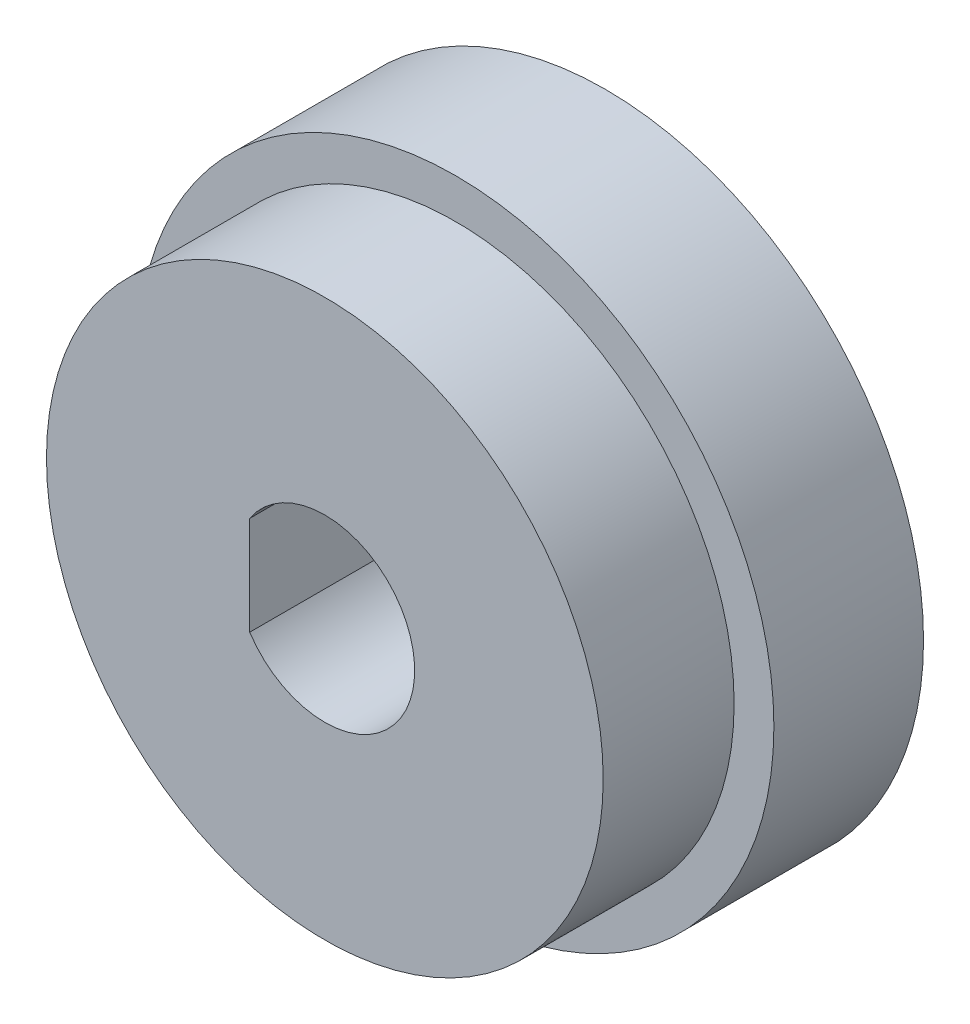
ISO-10303-21;
HEADER;
FILE_DESCRIPTION(('STEP AP214'),'2;1');
FILE_NAME('part.step','',(''),(''),'','','');
FILE_SCHEMA(('AUTOMOTIVE_DESIGN { 1 0 10303 214 1 1 1 1 }'));
ENDSEC;
DATA;
#1=APPLICATION_CONTEXT('core data for automotive mechanical design processes');
#2=APPLICATION_PROTOCOL_DEFINITION('international standard','automotive_design',2000,#1);
#3=PRODUCT_CONTEXT('',#1,'mechanical');
#4=PRODUCT('Part','Part','',(#3));
#5=PRODUCT_RELATED_PRODUCT_CATEGORY('part','',(#4));
#6=PRODUCT_DEFINITION_FORMATION('','',#4);
#7=PRODUCT_DEFINITION_CONTEXT('part definition',#1,'design');
#8=PRODUCT_DEFINITION('design','',#6,#7);
#9=PRODUCT_DEFINITION_SHAPE('','',#8);
#10=(LENGTH_UNIT() NAMED_UNIT(*) SI_UNIT(.MILLI.,.METRE.));
#11=(NAMED_UNIT(*) PLANE_ANGLE_UNIT() SI_UNIT($,.RADIAN.));
#12=(NAMED_UNIT(*) SI_UNIT($,.STERADIAN.) SOLID_ANGLE_UNIT());
#13=UNCERTAINTY_MEASURE_WITH_UNIT(LENGTH_MEASURE(1.E-05),#10,'distance_accuracy_value','');
#14=(GEOMETRIC_REPRESENTATION_CONTEXT(3) GLOBAL_UNCERTAINTY_ASSIGNED_CONTEXT((#13)) GLOBAL_UNIT_ASSIGNED_CONTEXT((#10,
#11,#12)) REPRESENTATION_CONTEXT('',''));
#15=CARTESIAN_POINT('',(0.,0.,0.));
#16=DIRECTION('',(0.,0.,1.));
#17=DIRECTION('',(1.,0.,0.));
#18=AXIS2_PLACEMENT_3D('',#15,#16,#17);
#19=CARTESIAN_POINT('',(0.,0.,5.08));
#20=DIRECTION('',(0.,0.,-1.));
#21=DIRECTION('',(-1.,0.,0.));
#22=AXIS2_PLACEMENT_3D('',#19,#20,#21);
#23=CYLINDRICAL_SURFACE('',#22,10.8);
#24=CARTESIAN_POINT('',(0.,0.,5.08));
#25=DIRECTION('',(0.,0.,1.));
#26=DIRECTION('',(1.,0.,0.));
#27=AXIS2_PLACEMENT_3D('',#24,#25,#26);
#28=CIRCLE('',#27,10.8);
#29=CARTESIAN_POINT('',(10.8,0.,5.08));
#30=VERTEX_POINT('',#29);
#31=EDGE_CURVE('E49',#30,#30,#28,.T.);
#32=ORIENTED_EDGE('',*,*,#31,.F.);
#33=EDGE_LOOP('',(#32));
#34=FACE_BOUND('',#33,.T.);
#35=CARTESIAN_POINT('',(0.,0.,0.));
#36=DIRECTION('',(0.,0.,1.));
#37=DIRECTION('',(1.,0.,0.));
#38=AXIS2_PLACEMENT_3D('',#35,#36,#37);
#39=CIRCLE('',#38,10.8);
#40=CARTESIAN_POINT('',(10.8,0.,0.));
#41=VERTEX_POINT('',#40);
#42=EDGE_CURVE('E44',#41,#41,#39,.T.);
#43=ORIENTED_EDGE('',*,*,#42,.T.);
#44=EDGE_LOOP('',(#43));
#45=FACE_BOUND('',#44,.T.);
#46=ADVANCED_FACE('F41',(#34,#45),#23,.T.);
#47=CARTESIAN_POINT('',(0.,0.,5.08));
#48=DIRECTION('',(0.,0.,1.));
#49=DIRECTION('',(1.,0.,0.));
#50=AXIS2_PLACEMENT_3D('',#47,#48,#49);
#51=PLANE('',#50);
#52=CARTESIAN_POINT('',(0.,0.,5.08));
#53=DIRECTION('',(0.,0.,1.));
#54=DIRECTION('',(1.,0.,0.));
#55=AXIS2_PLACEMENT_3D('',#52,#53,#54);
#56=CIRCLE('',#55,9.45);
#57=CARTESIAN_POINT('',(9.45,0.,5.08));
#58=VERTEX_POINT('',#57);
#59=EDGE_CURVE('E11',#58,#58,#56,.T.);
#60=ORIENTED_EDGE('',*,*,#59,.F.);
#61=EDGE_LOOP('',(#60));
#62=FACE_BOUND('',#61,.T.);
#63=ORIENTED_EDGE('',*,*,#31,.T.);
#64=EDGE_LOOP('',(#63));
#65=FACE_BOUND('',#64,.T.);
#66=ADVANCED_FACE('F100',(#62,#65),#51,.T.);
#67=CARTESIAN_POINT('',(0.,0.,0.));
#68=DIRECTION('',(0.,0.,1.));
#69=DIRECTION('',(1.,0.,0.));
#70=AXIS2_PLACEMENT_3D('',#67,#68,#69);
#71=PLANE('',#70);
#72=CARTESIAN_POINT('',(0.,0.,0.));
#73=DIRECTION('',(0.,0.,1.));
#74=DIRECTION('',(1.,0.,0.));
#75=AXIS2_PLACEMENT_3D('',#72,#73,#74);
#76=CIRCLE('',#75,3.05);
#77=CARTESIAN_POINT('',(-2.55,-1.67332005306815,0.));
#78=VERTEX_POINT('',#77);
#79=CARTESIAN_POINT('',(-2.55,1.67332005306815,0.));
#80=VERTEX_POINT('',#79);
#81=EDGE_CURVE('E84',#78,#80,#76,.T.);
#82=ORIENTED_EDGE('',*,*,#81,.T.);
#83=DIRECTION('',(0.,-1.,0.));
#84=VECTOR('',#83,1.);
#85=CARTESIAN_POINT('',(-2.55,0.,0.));
#86=LINE('',#85,#84);
#87=EDGE_CURVE('E73',#80,#78,#86,.T.);
#88=ORIENTED_EDGE('',*,*,#87,.T.);
#89=EDGE_LOOP('',(#82,#88));
#90=FACE_BOUND('',#89,.T.);
#91=ORIENTED_EDGE('',*,*,#42,.F.);
#92=EDGE_LOOP('',(#91));
#93=FACE_BOUND('',#92,.T.);
#94=ADVANCED_FACE('F97',(#90,#93),#71,.F.);
#95=CARTESIAN_POINT('',(0.,0.,9.525));
#96=DIRECTION('',(0.,0.,-1.));
#97=DIRECTION('',(-1.,0.,0.));
#98=AXIS2_PLACEMENT_3D('',#95,#96,#97);
#99=CYLINDRICAL_SURFACE('',#98,9.45);
#100=CARTESIAN_POINT('',(0.,0.,9.525));
#101=DIRECTION('',(0.,0.,1.));
#102=DIRECTION('',(1.,0.,0.));
#103=AXIS2_PLACEMENT_3D('',#100,#101,#102);
#104=CIRCLE('',#103,9.45);
#105=CARTESIAN_POINT('',(9.45,0.,9.525));
#106=VERTEX_POINT('',#105);
#107=EDGE_CURVE('E75',#106,#106,#104,.T.);
#108=ORIENTED_EDGE('',*,*,#107,.F.);
#109=EDGE_LOOP('',(#108));
#110=FACE_BOUND('',#109,.T.);
#111=ORIENTED_EDGE('',*,*,#59,.T.);
#112=EDGE_LOOP('',(#111));
#113=FACE_BOUND('',#112,.T.);
#114=ADVANCED_FACE('F99',(#110,#113),#99,.T.);
#115=CARTESIAN_POINT('',(0.,0.,9.525));
#116=DIRECTION('',(0.,0.,1.));
#117=DIRECTION('',(1.,0.,0.));
#118=AXIS2_PLACEMENT_3D('',#115,#116,#117);
#119=PLANE('',#118);
#120=DIRECTION('',(0.,-1.,0.));
#121=VECTOR('',#120,1.);
#122=CARTESIAN_POINT('',(-2.55,0.,9.525));
#123=LINE('',#122,#121);
#124=CARTESIAN_POINT('',(-2.55,1.67332005306815,9.525));
#125=VERTEX_POINT('',#124);
#126=CARTESIAN_POINT('',(-2.55,-1.67332005306815,9.525));
#127=VERTEX_POINT('',#126);
#128=EDGE_CURVE('E70',#125,#127,#123,.T.);
#129=ORIENTED_EDGE('',*,*,#128,.F.);
#130=CARTESIAN_POINT('',(0.,0.,9.525));
#131=DIRECTION('',(0.,0.,1.));
#132=DIRECTION('',(1.,0.,0.));
#133=AXIS2_PLACEMENT_3D('',#130,#131,#132);
#134=CIRCLE('',#133,3.05);
#135=EDGE_CURVE('E77',#127,#125,#134,.T.);
#136=ORIENTED_EDGE('',*,*,#135,.F.);
#137=EDGE_LOOP('',(#129,#136));
#138=FACE_BOUND('',#137,.T.);
#139=ORIENTED_EDGE('',*,*,#107,.T.);
#140=EDGE_LOOP('',(#139));
#141=FACE_BOUND('',#140,.T.);
#142=ADVANCED_FACE('F81',(#138,#141),#119,.T.);
#143=CARTESIAN_POINT('',(-2.55,0.,0.));
#144=DIRECTION('',(-1.,0.,0.));
#145=DIRECTION('',(0.,0.,1.));
#146=AXIS2_PLACEMENT_3D('',#143,#144,#145);
#147=PLANE('',#146);
#148=ORIENTED_EDGE('',*,*,#128,.T.);
#149=DIRECTION('',(0.,0.,1.));
#150=VECTOR('',#149,1.);
#151=CARTESIAN_POINT('',(-2.55,-1.67332005306815,0.));
#152=LINE('',#151,#150);
#153=EDGE_CURVE('E62',#78,#127,#152,.T.);
#154=ORIENTED_EDGE('',*,*,#153,.F.);
#155=ORIENTED_EDGE('',*,*,#87,.F.);
#156=DIRECTION('',(0.,0.,1.));
#157=VECTOR('',#156,1.);
#158=CARTESIAN_POINT('',(-2.55,1.67332005306815,0.));
#159=LINE('',#158,#157);
#160=EDGE_CURVE('E57',#80,#125,#159,.T.);
#161=ORIENTED_EDGE('',*,*,#160,.T.);
#162=EDGE_LOOP('',(#148,#154,#155,#161));
#163=FACE_BOUND('',#162,.T.);
#164=ADVANCED_FACE('F68',(#163),#147,.F.);
#165=CARTESIAN_POINT('',(0.,0.,0.));
#166=DIRECTION('',(0.,0.,1.));
#167=DIRECTION('',(1.,0.,0.));
#168=AXIS2_PLACEMENT_3D('',#165,#166,#167);
#169=CYLINDRICAL_SURFACE('',#168,3.05);
#170=ORIENTED_EDGE('',*,*,#135,.T.);
#171=ORIENTED_EDGE('',*,*,#160,.F.);
#172=ORIENTED_EDGE('',*,*,#81,.F.);
#173=ORIENTED_EDGE('',*,*,#153,.T.);
#174=EDGE_LOOP('',(#170,#171,#172,#173));
#175=FACE_BOUND('',#174,.T.);
#176=ADVANCED_FACE('F78',(#175),#169,.F.);
#177=CLOSED_SHELL('',(#46,#66,#94,#114,#142,#164,#176));
#178=MANIFOLD_SOLID_BREP('B2',#177);
#179=ADVANCED_BREP_SHAPE_REPRESENTATION('',(#18,#178),#14);
#180=SHAPE_DEFINITION_REPRESENTATION(#9,#179);
ENDSEC;
END-ISO-10303-21;
